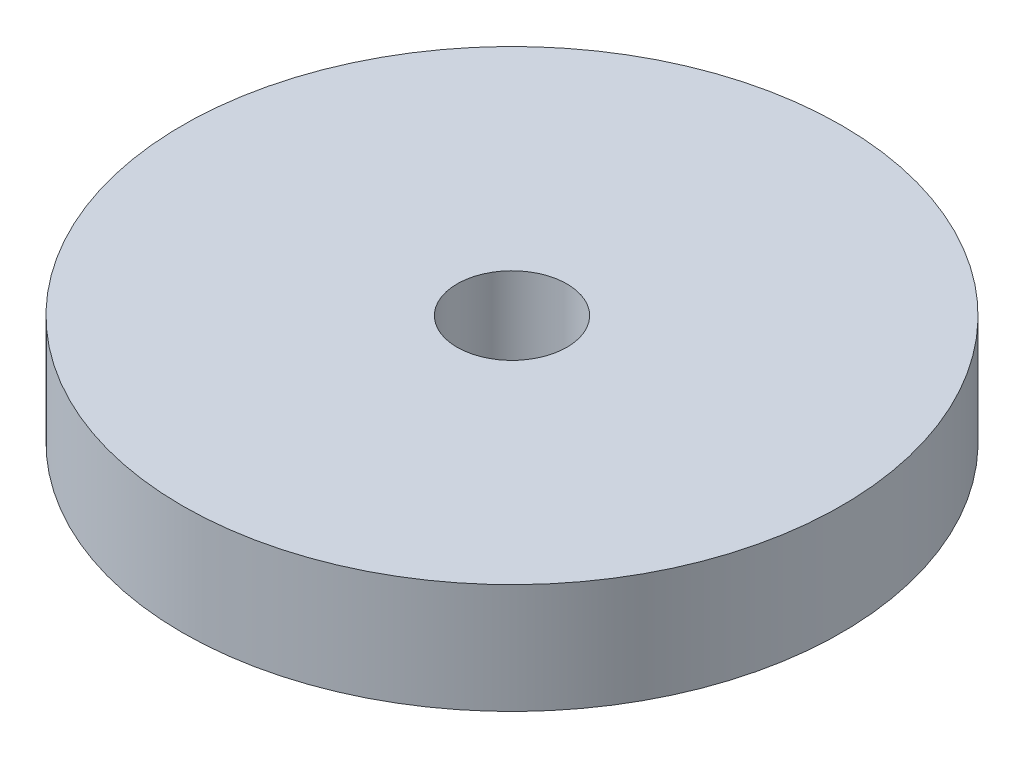
ISO-10303-21;
HEADER;
FILE_DESCRIPTION(('STEP AP214'),'2;1');
FILE_NAME('part.step','',(''),(''),'','','');
FILE_SCHEMA(('AUTOMOTIVE_DESIGN { 1 0 10303 214 1 1 1 1 }'));
ENDSEC;
DATA;
#1=APPLICATION_CONTEXT('core data for automotive mechanical design processes');
#2=APPLICATION_PROTOCOL_DEFINITION('international standard','automotive_design',2000,#1);
#3=PRODUCT_CONTEXT('',#1,'mechanical');
#4=PRODUCT('Part','Part','',(#3));
#5=PRODUCT_RELATED_PRODUCT_CATEGORY('part','',(#4));
#6=PRODUCT_DEFINITION_FORMATION('','',#4);
#7=PRODUCT_DEFINITION_CONTEXT('part definition',#1,'design');
#8=PRODUCT_DEFINITION('design','',#6,#7);
#9=PRODUCT_DEFINITION_SHAPE('','',#8);
#10=(LENGTH_UNIT() NAMED_UNIT(*) SI_UNIT(.MILLI.,.METRE.));
#11=(NAMED_UNIT(*) PLANE_ANGLE_UNIT() SI_UNIT($,.RADIAN.));
#12=(NAMED_UNIT(*) SI_UNIT($,.STERADIAN.) SOLID_ANGLE_UNIT());
#13=UNCERTAINTY_MEASURE_WITH_UNIT(LENGTH_MEASURE(1.E-05),#10,'distance_accuracy_value','');
#14=(GEOMETRIC_REPRESENTATION_CONTEXT(3) GLOBAL_UNCERTAINTY_ASSIGNED_CONTEXT((#13)) GLOBAL_UNIT_ASSIGNED_CONTEXT((#10,
#11,#12)) REPRESENTATION_CONTEXT('',''));
#15=CARTESIAN_POINT('',(0.,0.,0.));
#16=DIRECTION('',(0.,0.,1.));
#17=DIRECTION('',(1.,0.,0.));
#18=AXIS2_PLACEMENT_3D('',#15,#16,#17);
#19=CARTESIAN_POINT('',(0.,5.,0.));
#20=DIRECTION('',(0.,-1.,0.));
#21=DIRECTION('',(0.,0.,-1.));
#22=AXIS2_PLACEMENT_3D('',#19,#20,#21);
#23=CYLINDRICAL_SURFACE('',#22,15.);
#24=CARTESIAN_POINT('',(0.,5.,0.));
#25=DIRECTION('',(0.,1.,0.));
#26=DIRECTION('',(0.,0.,1.));
#27=AXIS2_PLACEMENT_3D('',#24,#25,#26);
#28=CIRCLE('',#27,15.);
#29=CARTESIAN_POINT('',(0.,5.,15.));
#30=VERTEX_POINT('',#29);
#31=EDGE_CURVE('E10',#30,#30,#28,.T.);
#32=ORIENTED_EDGE('',*,*,#31,.F.);
#33=EDGE_LOOP('',(#32));
#34=FACE_BOUND('',#33,.T.);
#35=CARTESIAN_POINT('',(0.,0.,0.));
#36=DIRECTION('',(0.,1.,0.));
#37=DIRECTION('',(0.,0.,1.));
#38=AXIS2_PLACEMENT_3D('',#35,#36,#37);
#39=CIRCLE('',#38,15.);
#40=CARTESIAN_POINT('',(0.,0.,15.));
#41=VERTEX_POINT('',#40);
#42=EDGE_CURVE('E34',#41,#41,#39,.T.);
#43=ORIENTED_EDGE('',*,*,#42,.T.);
#44=EDGE_LOOP('',(#43));
#45=FACE_BOUND('',#44,.T.);
#46=ADVANCED_FACE('F31',(#34,#45),#23,.T.);
#47=CARTESIAN_POINT('',(0.,5.,0.));
#48=DIRECTION('',(0.,1.,0.));
#49=DIRECTION('',(0.,0.,1.));
#50=AXIS2_PLACEMENT_3D('',#47,#48,#49);
#51=PLANE('',#50);
#52=CARTESIAN_POINT('',(0.,5.,0.));
#53=DIRECTION('',(0.,1.,0.));
#54=DIRECTION('',(0.,0.,1.));
#55=AXIS2_PLACEMENT_3D('',#52,#53,#54);
#56=CIRCLE('',#55,2.5);
#57=CARTESIAN_POINT('',(0.,5.,2.5));
#58=VERTEX_POINT('',#57);
#59=EDGE_CURVE('E45',#58,#58,#56,.T.);
#60=ORIENTED_EDGE('',*,*,#59,.F.);
#61=EDGE_LOOP('',(#60));
#62=FACE_BOUND('',#61,.T.);
#63=ORIENTED_EDGE('',*,*,#31,.T.);
#64=EDGE_LOOP('',(#63));
#65=FACE_BOUND('',#64,.T.);
#66=ADVANCED_FACE('F52',(#62,#65),#51,.T.);
#67=CARTESIAN_POINT('',(0.,0.,0.));
#68=DIRECTION('',(0.,1.,0.));
#69=DIRECTION('',(0.,0.,1.));
#70=AXIS2_PLACEMENT_3D('',#67,#68,#69);
#71=PLANE('',#70);
#72=CARTESIAN_POINT('',(0.,0.,0.));
#73=DIRECTION('',(0.,1.,0.));
#74=DIRECTION('',(0.,0.,1.));
#75=AXIS2_PLACEMENT_3D('',#72,#73,#74);
#76=CIRCLE('',#75,2.5);
#77=CARTESIAN_POINT('',(0.,0.,2.5));
#78=VERTEX_POINT('',#77);
#79=EDGE_CURVE('E41',#78,#78,#76,.F.);
#80=ORIENTED_EDGE('',*,*,#79,.F.);
#81=EDGE_LOOP('',(#80));
#82=FACE_BOUND('',#81,.T.);
#83=ORIENTED_EDGE('',*,*,#42,.F.);
#84=EDGE_LOOP('',(#83));
#85=FACE_BOUND('',#84,.T.);
#86=ADVANCED_FACE('F54',(#82,#85),#71,.F.);
#87=CARTESIAN_POINT('',(0.,-0.00100000000000013,0.));
#88=DIRECTION('',(0.,1.,0.));
#89=DIRECTION('',(0.,0.,1.));
#90=AXIS2_PLACEMENT_3D('',#87,#88,#89);
#91=CYLINDRICAL_SURFACE('',#90,2.5);
#92=ORIENTED_EDGE('',*,*,#59,.T.);
#93=EDGE_LOOP('',(#92));
#94=FACE_BOUND('',#93,.T.);
#95=ORIENTED_EDGE('',*,*,#79,.T.);
#96=EDGE_LOOP('',(#95));
#97=FACE_BOUND('',#96,.T.);
#98=ADVANCED_FACE('F49',(#94,#97),#91,.F.);
#99=CLOSED_SHELL('',(#46,#66,#86,#98));
#100=MANIFOLD_SOLID_BREP('B2',#99);
#101=ADVANCED_BREP_SHAPE_REPRESENTATION('',(#18,#100),#14);
#102=SHAPE_DEFINITION_REPRESENTATION(#9,#101);
ENDSEC;
END-ISO-10303-21;
